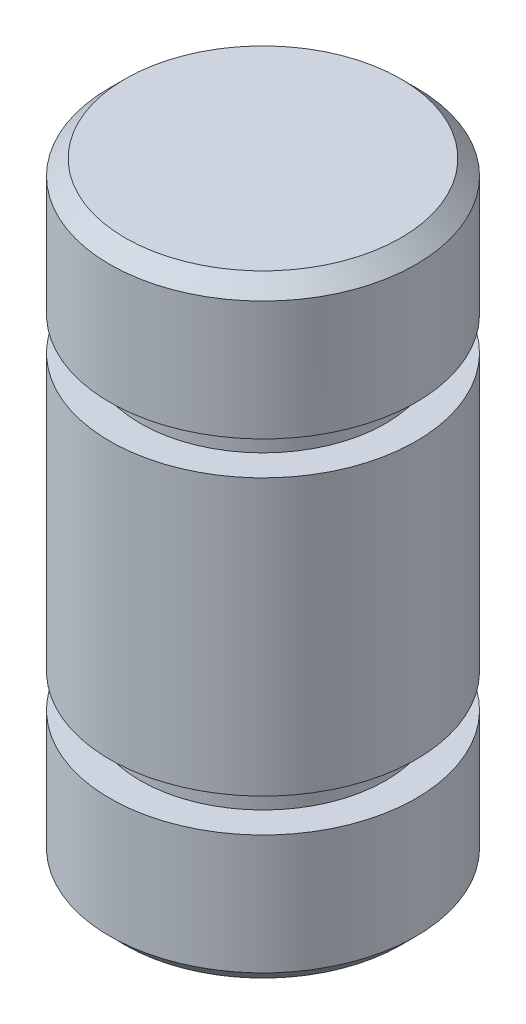
ISO-10303-21;
HEADER;
FILE_DESCRIPTION(('STEP AP214'),'2;1');
FILE_NAME('part.step','',(''),(''),'','','');
FILE_SCHEMA(('AUTOMOTIVE_DESIGN { 1 0 10303 214 1 1 1 1 }'));
ENDSEC;
DATA;
#1=APPLICATION_CONTEXT('core data for automotive mechanical design processes');
#2=APPLICATION_PROTOCOL_DEFINITION('international standard','automotive_design',2000,#1);
#3=PRODUCT_CONTEXT('',#1,'mechanical');
#4=PRODUCT('Part','Part','',(#3));
#5=PRODUCT_RELATED_PRODUCT_CATEGORY('part','',(#4));
#6=PRODUCT_DEFINITION_FORMATION('','',#4);
#7=PRODUCT_DEFINITION_CONTEXT('part definition',#1,'design');
#8=PRODUCT_DEFINITION('design','',#6,#7);
#9=PRODUCT_DEFINITION_SHAPE('','',#8);
#10=(LENGTH_UNIT() NAMED_UNIT(*) SI_UNIT(.MILLI.,.METRE.));
#11=(NAMED_UNIT(*) PLANE_ANGLE_UNIT() SI_UNIT($,.RADIAN.));
#12=(NAMED_UNIT(*) SI_UNIT($,.STERADIAN.) SOLID_ANGLE_UNIT());
#13=UNCERTAINTY_MEASURE_WITH_UNIT(LENGTH_MEASURE(1.E-05),#10,'distance_accuracy_value','');
#14=(GEOMETRIC_REPRESENTATION_CONTEXT(3) GLOBAL_UNCERTAINTY_ASSIGNED_CONTEXT((#13)) GLOBAL_UNIT_ASSIGNED_CONTEXT((#10,
#11,#12)) REPRESENTATION_CONTEXT('',''));
#15=CARTESIAN_POINT('',(0.,0.,0.));
#16=DIRECTION('',(0.,0.,1.));
#17=DIRECTION('',(1.,0.,0.));
#18=AXIS2_PLACEMENT_3D('',#15,#16,#17);
#19=CARTESIAN_POINT('',(0.,20.,0.));
#20=DIRECTION('',(0.,1.,0.));
#21=DIRECTION('',(0.,0.,1.));
#22=AXIS2_PLACEMENT_3D('',#19,#20,#21);
#23=PLANE('',#22);
#24=CARTESIAN_POINT('',(0.,20.,0.));
#25=DIRECTION('',(0.,1.,0.));
#26=DIRECTION('',(0.,0.,1.));
#27=AXIS2_PLACEMENT_3D('',#24,#25,#26);
#28=CIRCLE('',#27,4.5);
#29=CARTESIAN_POINT('',(0.,20.,4.5));
#30=VERTEX_POINT('',#29);
#31=EDGE_CURVE('E10',#30,#30,#28,.T.);
#32=ORIENTED_EDGE('',*,*,#31,.T.);
#33=EDGE_LOOP('',(#32));
#34=FACE_BOUND('',#33,.T.);
#35=ADVANCED_FACE('F39',(#34),#23,.T.);
#36=CARTESIAN_POINT('',(0.,0.,0.));
#37=DIRECTION('',(0.,-1.,0.));
#38=DIRECTION('',(0.,0.,-1.));
#39=AXIS2_PLACEMENT_3D('',#36,#37,#38);
#40=CYLINDRICAL_SURFACE('',#39,5.);
#41=CARTESIAN_POINT('',(0.,19.5,0.));
#42=DIRECTION('',(0.,1.,0.));
#43=DIRECTION('',(0.,0.,1.));
#44=AXIS2_PLACEMENT_3D('',#41,#42,#43);
#45=CIRCLE('',#44,5.);
#46=CARTESIAN_POINT('',(0.,19.5,5.));
#47=VERTEX_POINT('',#46);
#48=EDGE_CURVE('E47',#47,#47,#45,.F.);
#49=ORIENTED_EDGE('',*,*,#48,.T.);
#50=EDGE_LOOP('',(#49));
#51=FACE_BOUND('',#50,.T.);
#52=CARTESIAN_POINT('',(0.,15.6,0.));
#53=DIRECTION('',(0.,-1.,0.));
#54=DIRECTION('',(0.,0.,-1.));
#55=AXIS2_PLACEMENT_3D('',#52,#53,#54);
#56=CIRCLE('',#55,5.);
#57=CARTESIAN_POINT('',(0.,15.6,-5.));
#58=VERTEX_POINT('',#57);
#59=EDGE_CURVE('E60',#58,#58,#56,.T.);
#60=ORIENTED_EDGE('',*,*,#59,.F.);
#61=EDGE_LOOP('',(#60));
#62=FACE_BOUND('',#61,.T.);
#63=ADVANCED_FACE('F103',(#51,#62),#40,.T.);
#64=CARTESIAN_POINT('',(5.,15.6,0.));
#65=DIRECTION('',(0.,-1.,0.));
#66=DIRECTION('',(0.,0.,-1.));
#67=AXIS2_PLACEMENT_3D('',#64,#65,#66);
#68=PLANE('',#67);
#69=ORIENTED_EDGE('',*,*,#59,.T.);
#70=EDGE_LOOP('',(#69));
#71=FACE_BOUND('',#70,.T.);
#72=CARTESIAN_POINT('',(0.,15.6,0.));
#73=DIRECTION('',(0.,-1.,0.));
#74=DIRECTION('',(0.,0.,-1.));
#75=AXIS2_PLACEMENT_3D('',#72,#73,#74);
#76=CIRCLE('',#75,4.);
#77=CARTESIAN_POINT('',(0.,15.6,-4.));
#78=VERTEX_POINT('',#77);
#79=EDGE_CURVE('E63',#78,#78,#76,.T.);
#80=ORIENTED_EDGE('',*,*,#79,.F.);
#81=EDGE_LOOP('',(#80));
#82=FACE_BOUND('',#81,.T.);
#83=ADVANCED_FACE('F108',(#71,#82),#68,.T.);
#84=CARTESIAN_POINT('',(0.,0.,0.));
#85=DIRECTION('',(0.,-1.,0.));
#86=DIRECTION('',(0.,0.,-1.));
#87=AXIS2_PLACEMENT_3D('',#84,#85,#86);
#88=CYLINDRICAL_SURFACE('',#87,4.);
#89=ORIENTED_EDGE('',*,*,#79,.T.);
#90=EDGE_LOOP('',(#89));
#91=FACE_BOUND('',#90,.T.);
#92=CARTESIAN_POINT('',(0.,14.5,0.));
#93=DIRECTION('',(0.,-1.,0.));
#94=DIRECTION('',(0.,0.,-1.));
#95=AXIS2_PLACEMENT_3D('',#92,#93,#94);
#96=CIRCLE('',#95,4.);
#97=CARTESIAN_POINT('',(0.,14.5,-4.));
#98=VERTEX_POINT('',#97);
#99=EDGE_CURVE('E66',#98,#98,#96,.T.);
#100=ORIENTED_EDGE('',*,*,#99,.F.);
#101=EDGE_LOOP('',(#100));
#102=FACE_BOUND('',#101,.T.);
#103=ADVANCED_FACE('F152',(#91,#102),#88,.T.);
#104=CARTESIAN_POINT('',(5.,14.5,0.));
#105=DIRECTION('',(0.,1.,0.));
#106=DIRECTION('',(0.,0.,1.));
#107=AXIS2_PLACEMENT_3D('',#104,#105,#106);
#108=PLANE('',#107);
#109=ORIENTED_EDGE('',*,*,#99,.T.);
#110=EDGE_LOOP('',(#109));
#111=FACE_BOUND('',#110,.T.);
#112=CARTESIAN_POINT('',(0.,14.5,0.));
#113=DIRECTION('',(0.,-1.,0.));
#114=DIRECTION('',(0.,0.,-1.));
#115=AXIS2_PLACEMENT_3D('',#112,#113,#114);
#116=CIRCLE('',#115,5.);
#117=CARTESIAN_POINT('',(0.,14.5,-5.));
#118=VERTEX_POINT('',#117);
#119=EDGE_CURVE('E69',#118,#118,#116,.T.);
#120=ORIENTED_EDGE('',*,*,#119,.F.);
#121=EDGE_LOOP('',(#120));
#122=FACE_BOUND('',#121,.T.);
#123=ADVANCED_FACE('F161',(#111,#122),#108,.T.);
#124=CARTESIAN_POINT('',(0.,0.,0.));
#125=DIRECTION('',(0.,-1.,0.));
#126=DIRECTION('',(0.,0.,-1.));
#127=AXIS2_PLACEMENT_3D('',#124,#125,#126);
#128=CYLINDRICAL_SURFACE('',#127,5.);
#129=ORIENTED_EDGE('',*,*,#119,.T.);
#130=EDGE_LOOP('',(#129));
#131=FACE_BOUND('',#130,.T.);
#132=CARTESIAN_POINT('',(0.,5.5,0.));
#133=DIRECTION('',(0.,-1.,0.));
#134=DIRECTION('',(0.,0.,-1.));
#135=AXIS2_PLACEMENT_3D('',#132,#133,#134);
#136=CIRCLE('',#135,5.);
#137=CARTESIAN_POINT('',(0.,5.5,-5.));
#138=VERTEX_POINT('',#137);
#139=EDGE_CURVE('E72',#138,#138,#136,.T.);
#140=ORIENTED_EDGE('',*,*,#139,.F.);
#141=EDGE_LOOP('',(#140));
#142=FACE_BOUND('',#141,.T.);
#143=ADVANCED_FACE('F171',(#131,#142),#128,.T.);
#144=CARTESIAN_POINT('',(5.,5.5,0.));
#145=DIRECTION('',(0.,-1.,0.));
#146=DIRECTION('',(0.,0.,-1.));
#147=AXIS2_PLACEMENT_3D('',#144,#145,#146);
#148=PLANE('',#147);
#149=ORIENTED_EDGE('',*,*,#139,.T.);
#150=EDGE_LOOP('',(#149));
#151=FACE_BOUND('',#150,.T.);
#152=CARTESIAN_POINT('',(0.,5.5,0.));
#153=DIRECTION('',(0.,-1.,0.));
#154=DIRECTION('',(0.,0.,-1.));
#155=AXIS2_PLACEMENT_3D('',#152,#153,#154);
#156=CIRCLE('',#155,4.);
#157=CARTESIAN_POINT('',(0.,5.5,-4.));
#158=VERTEX_POINT('',#157);
#159=EDGE_CURVE('E75',#158,#158,#156,.T.);
#160=ORIENTED_EDGE('',*,*,#159,.F.);
#161=EDGE_LOOP('',(#160));
#162=FACE_BOUND('',#161,.T.);
#163=ADVANCED_FACE('F100',(#151,#162),#148,.T.);
#164=CARTESIAN_POINT('',(0.,0.,0.));
#165=DIRECTION('',(0.,-1.,0.));
#166=DIRECTION('',(0.,0.,-1.));
#167=AXIS2_PLACEMENT_3D('',#164,#165,#166);
#168=CYLINDRICAL_SURFACE('',#167,4.);
#169=ORIENTED_EDGE('',*,*,#159,.T.);
#170=EDGE_LOOP('',(#169));
#171=FACE_BOUND('',#170,.T.);
#172=CARTESIAN_POINT('',(0.,4.4,0.));
#173=DIRECTION('',(0.,-1.,0.));
#174=DIRECTION('',(0.,0.,-1.));
#175=AXIS2_PLACEMENT_3D('',#172,#173,#174);
#176=CIRCLE('',#175,4.);
#177=CARTESIAN_POINT('',(0.,4.4,-4.));
#178=VERTEX_POINT('',#177);
#179=EDGE_CURVE('E78',#178,#178,#176,.T.);
#180=ORIENTED_EDGE('',*,*,#179,.F.);
#181=EDGE_LOOP('',(#180));
#182=FACE_BOUND('',#181,.T.);
#183=ADVANCED_FACE('F89',(#171,#182),#168,.T.);
#184=CARTESIAN_POINT('',(5.,4.4,0.));
#185=DIRECTION('',(0.,1.,0.));
#186=DIRECTION('',(0.,0.,1.));
#187=AXIS2_PLACEMENT_3D('',#184,#185,#186);
#188=PLANE('',#187);
#189=ORIENTED_EDGE('',*,*,#179,.T.);
#190=EDGE_LOOP('',(#189));
#191=FACE_BOUND('',#190,.T.);
#192=CARTESIAN_POINT('',(0.,4.4,0.));
#193=DIRECTION('',(0.,-1.,0.));
#194=DIRECTION('',(0.,0.,-1.));
#195=AXIS2_PLACEMENT_3D('',#192,#193,#194);
#196=CIRCLE('',#195,5.);
#197=CARTESIAN_POINT('',(0.,4.4,-5.));
#198=VERTEX_POINT('',#197);
#199=EDGE_CURVE('E81',#198,#198,#196,.T.);
#200=ORIENTED_EDGE('',*,*,#199,.F.);
#201=EDGE_LOOP('',(#200));
#202=FACE_BOUND('',#201,.T.);
#203=ADVANCED_FACE('F87',(#191,#202),#188,.T.);
#204=CARTESIAN_POINT('',(0.,0.,0.));
#205=DIRECTION('',(0.,-1.,0.));
#206=DIRECTION('',(0.,0.,-1.));
#207=AXIS2_PLACEMENT_3D('',#204,#205,#206);
#208=CYLINDRICAL_SURFACE('',#207,5.);
#209=CARTESIAN_POINT('',(0.,0.5,0.));
#210=DIRECTION('',(0.,-1.,0.));
#211=DIRECTION('',(0.,0.,-1.));
#212=AXIS2_PLACEMENT_3D('',#209,#210,#211);
#213=CIRCLE('',#212,5.);
#214=CARTESIAN_POINT('',(0.,0.5,-5.));
#215=VERTEX_POINT('',#214);
#216=EDGE_CURVE('E51',#215,#215,#213,.F.);
#217=ORIENTED_EDGE('',*,*,#216,.T.);
#218=EDGE_LOOP('',(#217));
#219=FACE_BOUND('',#218,.T.);
#220=ORIENTED_EDGE('',*,*,#199,.T.);
#221=EDGE_LOOP('',(#220));
#222=FACE_BOUND('',#221,.T.);
#223=ADVANCED_FACE('F85',(#219,#222),#208,.T.);
#224=CARTESIAN_POINT('',(0.,0.,0.));
#225=DIRECTION('',(0.,-1.,0.));
#226=DIRECTION('',(0.,0.,-1.));
#227=AXIS2_PLACEMENT_3D('',#224,#225,#226);
#228=PLANE('',#227);
#229=CARTESIAN_POINT('',(0.,0.,0.));
#230=DIRECTION('',(0.,-1.,0.));
#231=DIRECTION('',(0.,0.,-1.));
#232=AXIS2_PLACEMENT_3D('',#229,#230,#231);
#233=CIRCLE('',#232,4.5);
#234=CARTESIAN_POINT('',(0.,0.,-4.5));
#235=VERTEX_POINT('',#234);
#236=EDGE_CURVE('E55',#235,#235,#233,.T.);
#237=ORIENTED_EDGE('',*,*,#236,.T.);
#238=EDGE_LOOP('',(#237));
#239=FACE_BOUND('',#238,.T.);
#240=ADVANCED_FACE('F97',(#239),#228,.T.);
#241=CARTESIAN_POINT('',(0.,0.,0.));
#242=DIRECTION('',(0.,1.,0.));
#243=DIRECTION('',(0.,0.,1.));
#244=AXIS2_PLACEMENT_3D('',#241,#242,#243);
#245=CONICAL_SURFACE('',#244,4.5,0.785398163397445);
#246=ORIENTED_EDGE('',*,*,#216,.F.);
#247=EDGE_LOOP('',(#246));
#248=FACE_BOUND('',#247,.T.);
#249=ORIENTED_EDGE('',*,*,#236,.F.);
#250=EDGE_LOOP('',(#249));
#251=FACE_BOUND('',#250,.T.);
#252=ADVANCED_FACE('F112',(#248,#251),#245,.T.);
#253=CARTESIAN_POINT('',(0.,19.5,0.));
#254=DIRECTION('',(0.,-1.,0.));
#255=DIRECTION('',(0.,0.,-1.));
#256=AXIS2_PLACEMENT_3D('',#253,#254,#255);
#257=CONICAL_SURFACE('',#256,5.,0.785398163397453);
#258=ORIENTED_EDGE('',*,*,#31,.F.);
#259=EDGE_LOOP('',(#258));
#260=FACE_BOUND('',#259,.T.);
#261=ORIENTED_EDGE('',*,*,#48,.F.);
#262=EDGE_LOOP('',(#261));
#263=FACE_BOUND('',#262,.T.);
#264=ADVANCED_FACE('F42',(#260,#263),#257,.T.);
#265=CLOSED_SHELL('',(#35,#63,#83,#103,#123,#143,#163,#183,#203,#223,#240,#252,#264));
#266=MANIFOLD_SOLID_BREP('B2',#265);
#267=ADVANCED_BREP_SHAPE_REPRESENTATION('',(#18,#266),#14);
#268=SHAPE_DEFINITION_REPRESENTATION(#9,#267);
ENDSEC;
END-ISO-10303-21;
